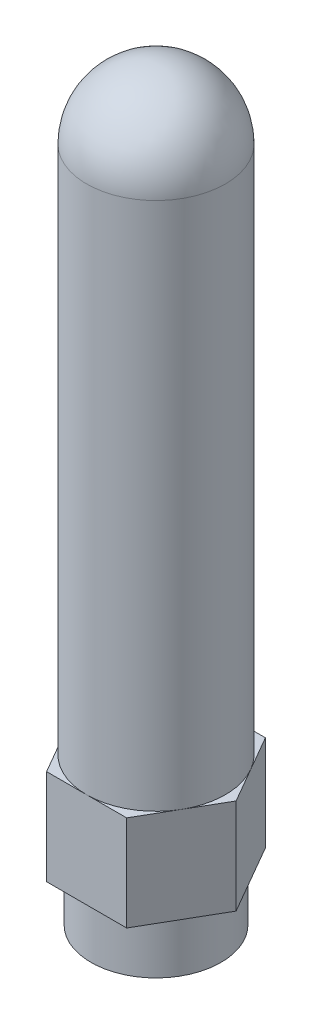
ISO-10303-21;
HEADER;
FILE_DESCRIPTION(('STEP AP214'),'2;1');
FILE_NAME('part.step','',(''),(''),'','','');
FILE_SCHEMA(('AUTOMOTIVE_DESIGN { 1 0 10303 214 1 1 1 1 }'));
ENDSEC;
DATA;
#1=APPLICATION_CONTEXT('core data for automotive mechanical design processes');
#2=APPLICATION_PROTOCOL_DEFINITION('international standard','automotive_design',2000,#1);
#3=PRODUCT_CONTEXT('',#1,'mechanical');
#4=PRODUCT('Part','Part','',(#3));
#5=PRODUCT_RELATED_PRODUCT_CATEGORY('part','',(#4));
#6=PRODUCT_DEFINITION_FORMATION('','',#4);
#7=PRODUCT_DEFINITION_CONTEXT('part definition',#1,'design');
#8=PRODUCT_DEFINITION('design','',#6,#7);
#9=PRODUCT_DEFINITION_SHAPE('','',#8);
#10=(LENGTH_UNIT() NAMED_UNIT(*) SI_UNIT(.MILLI.,.METRE.));
#11=(NAMED_UNIT(*) PLANE_ANGLE_UNIT() SI_UNIT($,.RADIAN.));
#12=(NAMED_UNIT(*) SI_UNIT($,.STERADIAN.) SOLID_ANGLE_UNIT());
#13=UNCERTAINTY_MEASURE_WITH_UNIT(LENGTH_MEASURE(1.E-05),#10,'distance_accuracy_value','');
#14=(GEOMETRIC_REPRESENTATION_CONTEXT(3) GLOBAL_UNCERTAINTY_ASSIGNED_CONTEXT((#13)) GLOBAL_UNIT_ASSIGNED_CONTEXT((#10,
#11,#12)) REPRESENTATION_CONTEXT('',''));
#15=CARTESIAN_POINT('',(0.,0.,0.));
#16=DIRECTION('',(0.,0.,1.));
#17=DIRECTION('',(1.,0.,0.));
#18=AXIS2_PLACEMENT_3D('',#15,#16,#17);
#19=CARTESIAN_POINT('',(0.,36.,0.));
#20=DIRECTION('',(0.,-1.,0.));
#21=DIRECTION('',(1.,0.,0.));
#22=AXIS2_PLACEMENT_3D('',#19,#20,#21);
#23=SPHERICAL_SURFACE('',#22,4.);
#24=CARTESIAN_POINT('',(0.,36.,0.));
#25=DIRECTION('',(0.,-1.,0.));
#26=DIRECTION('',(0.,0.,-1.));
#27=AXIS2_PLACEMENT_3D('',#24,#25,#26);
#28=CIRCLE('',#27,4.);
#29=CARTESIAN_POINT('',(0.,36.,-4.));
#30=VERTEX_POINT('',#29);
#31=EDGE_CURVE('E139',#30,#30,#28,.T.);
#32=ORIENTED_EDGE('',*,*,#31,.F.);
#33=EDGE_LOOP('',(#32));
#34=FACE_BOUND('',#33,.T.);
#35=ADVANCED_FACE('F38',(#34),#23,.T.);
#36=CARTESIAN_POINT('',(0.,0.,0.));
#37=DIRECTION('',(0.,-1.,0.));
#38=DIRECTION('',(0.,0.,-1.));
#39=AXIS2_PLACEMENT_3D('',#36,#37,#38);
#40=CYLINDRICAL_SURFACE('',#39,4.);
#41=CARTESIAN_POINT('',(0.,5.5,0.));
#42=DIRECTION('',(0.,1.,0.));
#43=DIRECTION('',(0.,0.,1.));
#44=AXIS2_PLACEMENT_3D('',#41,#42,#43);
#45=CIRCLE('',#44,4.);
#46=CARTESIAN_POINT('',(0.,5.5,4.));
#47=VERTEX_POINT('',#46);
#48=CARTESIAN_POINT('',(-3.46410161513776,5.5,2.));
#49=VERTEX_POINT('',#48);
#50=EDGE_CURVE('E47',#47,#49,#45,.F.);
#51=ORIENTED_EDGE('',*,*,#50,.F.);
#52=CARTESIAN_POINT('',(3.46410161513775,5.5,2.));
#53=VERTEX_POINT('',#52);
#54=EDGE_CURVE('E41',#53,#47,#45,.F.);
#55=ORIENTED_EDGE('',*,*,#54,.F.);
#56=CARTESIAN_POINT('',(3.46410161513775,5.5,-2.));
#57=VERTEX_POINT('',#56);
#58=EDGE_CURVE('E114',#57,#53,#45,.F.);
#59=ORIENTED_EDGE('',*,*,#58,.F.);
#60=CARTESIAN_POINT('',(0.,5.5,-4.));
#61=VERTEX_POINT('',#60);
#62=EDGE_CURVE('E249',#61,#57,#45,.F.);
#63=ORIENTED_EDGE('',*,*,#62,.F.);
#64=CARTESIAN_POINT('',(-3.46410161513775,5.5,-2.));
#65=VERTEX_POINT('',#64);
#66=EDGE_CURVE('E60',#65,#61,#45,.F.);
#67=ORIENTED_EDGE('',*,*,#66,.F.);
#68=EDGE_CURVE('E55',#49,#65,#45,.F.);
#69=ORIENTED_EDGE('',*,*,#68,.F.);
#70=EDGE_LOOP('',(#51,#55,#59,#63,#67,#69));
#71=FACE_BOUND('',#70,.T.);
#72=ORIENTED_EDGE('',*,*,#31,.T.);
#73=EDGE_LOOP('',(#72));
#74=FACE_BOUND('',#73,.T.);
#75=ADVANCED_FACE('F282',(#71,#74),#40,.T.);
#76=CARTESIAN_POINT('',(0.,5.5,0.));
#77=DIRECTION('',(0.,1.,0.));
#78=DIRECTION('',(0.,0.,1.));
#79=AXIS2_PLACEMENT_3D('',#76,#77,#78);
#80=PLANE('',#79);
#81=DIRECTION('',(1.,0.,0.));
#82=VECTOR('',#81,1.);
#83=CARTESIAN_POINT('',(-2.3094010767585,5.5,4.));
#84=LINE('',#83,#82);
#85=CARTESIAN_POINT('',(-2.3094010767585,5.5,4.));
#86=VERTEX_POINT('',#85);
#87=EDGE_CURVE('E163',#86,#47,#84,.T.);
#88=ORIENTED_EDGE('',*,*,#87,.T.);
#89=ORIENTED_EDGE('',*,*,#50,.T.);
#90=DIRECTION('',(0.5,0.,0.866025403784439));
#91=VECTOR('',#90,1.);
#92=CARTESIAN_POINT('',(-4.61880215351701,5.5,0.));
#93=LINE('',#92,#91);
#94=EDGE_CURVE('E189',#49,#86,#93,.T.);
#95=ORIENTED_EDGE('',*,*,#94,.T.);
#96=EDGE_LOOP('',(#88,#89,#95));
#97=FACE_BOUND('',#96,.T.);
#98=ADVANCED_FACE('F281',(#97),#80,.T.);
#99=CARTESIAN_POINT('',(-4.61880215351701,5.5,0.));
#100=VERTEX_POINT('',#99);
#101=EDGE_CURVE('E185',#100,#49,#93,.T.);
#102=ORIENTED_EDGE('',*,*,#101,.T.);
#103=ORIENTED_EDGE('',*,*,#68,.T.);
#104=DIRECTION('',(-0.5,0.,0.866025403784439));
#105=VECTOR('',#104,1.);
#106=CARTESIAN_POINT('',(-2.3094010767585,5.5,-4.));
#107=LINE('',#106,#105);
#108=EDGE_CURVE('E194',#65,#100,#107,.T.);
#109=ORIENTED_EDGE('',*,*,#108,.T.);
#110=EDGE_LOOP('',(#102,#103,#109));
#111=FACE_BOUND('',#110,.T.);
#112=ADVANCED_FACE('F303',(#111),#80,.T.);
#113=CARTESIAN_POINT('',(-2.3094010767585,5.5,-4.));
#114=VERTEX_POINT('',#113);
#115=EDGE_CURVE('E190',#114,#65,#107,.T.);
#116=ORIENTED_EDGE('',*,*,#115,.T.);
#117=ORIENTED_EDGE('',*,*,#66,.T.);
#118=DIRECTION('',(-1.,0.,0.));
#119=VECTOR('',#118,1.);
#120=CARTESIAN_POINT('',(2.3094010767585,5.5,-4.));
#121=LINE('',#120,#119);
#122=EDGE_CURVE('E131',#61,#114,#121,.T.);
#123=ORIENTED_EDGE('',*,*,#122,.T.);
#124=EDGE_LOOP('',(#116,#117,#123));
#125=FACE_BOUND('',#124,.T.);
#126=ADVANCED_FACE('F273',(#125),#80,.T.);
#127=CARTESIAN_POINT('',(2.3094010767585,5.5,-4.));
#128=VERTEX_POINT('',#127);
#129=EDGE_CURVE('E195',#128,#61,#121,.T.);
#130=ORIENTED_EDGE('',*,*,#129,.T.);
#131=ORIENTED_EDGE('',*,*,#62,.T.);
#132=DIRECTION('',(-0.5,0.,-0.866025403784439));
#133=VECTOR('',#132,1.);
#134=CARTESIAN_POINT('',(4.61880215351701,5.5,0.));
#135=LINE('',#134,#133);
#136=EDGE_CURVE('E129',#57,#128,#135,.T.);
#137=ORIENTED_EDGE('',*,*,#136,.T.);
#138=EDGE_LOOP('',(#130,#131,#137));
#139=FACE_BOUND('',#138,.T.);
#140=ADVANCED_FACE('F248',(#139),#80,.T.);
#141=CARTESIAN_POINT('',(4.61880215351701,5.5,0.));
#142=VERTEX_POINT('',#141);
#143=EDGE_CURVE('E113',#142,#57,#135,.T.);
#144=ORIENTED_EDGE('',*,*,#143,.T.);
#145=ORIENTED_EDGE('',*,*,#58,.T.);
#146=DIRECTION('',(0.5,0.,-0.866025403784439));
#147=VECTOR('',#146,1.);
#148=CARTESIAN_POINT('',(2.3094010767585,5.5,4.));
#149=LINE('',#148,#147);
#150=EDGE_CURVE('E110',#53,#142,#149,.T.);
#151=ORIENTED_EDGE('',*,*,#150,.T.);
#152=EDGE_LOOP('',(#144,#145,#151));
#153=FACE_BOUND('',#152,.T.);
#154=ADVANCED_FACE('F112',(#153),#80,.T.);
#155=CARTESIAN_POINT('',(2.3094010767585,5.5,4.));
#156=DIRECTION('',(-0.866025403784439,0.,-0.5));
#157=DIRECTION('',(-0.5,0.,0.866025403784439));
#158=AXIS2_PLACEMENT_3D('',#155,#156,#157);
#159=PLANE('',#158);
#160=DIRECTION('',(0.5,0.,-0.866025403784439));
#161=VECTOR('',#160,1.);
#162=CARTESIAN_POINT('',(2.3094010767585,0.,4.));
#163=LINE('',#162,#161);
#164=CARTESIAN_POINT('',(2.3094010767585,0.,4.));
#165=VERTEX_POINT('',#164);
#166=CARTESIAN_POINT('',(4.61880215351701,0.,0.));
#167=VERTEX_POINT('',#166);
#168=EDGE_CURVE('E136',#165,#167,#163,.T.);
#169=ORIENTED_EDGE('',*,*,#168,.T.);
#170=DIRECTION('',(0.,-1.,0.));
#171=VECTOR('',#170,1.);
#172=CARTESIAN_POINT('',(4.61880215351701,5.5,0.));
#173=LINE('',#172,#171);
#174=EDGE_CURVE('E127',#142,#167,#173,.T.);
#175=ORIENTED_EDGE('',*,*,#174,.F.);
#176=ORIENTED_EDGE('',*,*,#150,.F.);
#177=CARTESIAN_POINT('',(2.3094010767585,5.5,4.));
#178=VERTEX_POINT('',#177);
#179=EDGE_CURVE('E120',#178,#53,#149,.T.);
#180=ORIENTED_EDGE('',*,*,#179,.F.);
#181=DIRECTION('',(0.,-1.,0.));
#182=VECTOR('',#181,1.);
#183=CARTESIAN_POINT('',(2.3094010767585,5.5,4.));
#184=LINE('',#183,#182);
#185=EDGE_CURVE('E160',#178,#165,#184,.T.);
#186=ORIENTED_EDGE('',*,*,#185,.T.);
#187=EDGE_LOOP('',(#169,#175,#176,#180,#186));
#188=FACE_BOUND('',#187,.T.);
#189=ADVANCED_FACE('F133',(#188),#159,.F.);
#190=CARTESIAN_POINT('',(4.61880215351701,5.5,0.));
#191=DIRECTION('',(-0.866025403784439,0.,0.5));
#192=DIRECTION('',(0.5,0.,0.866025403784439));
#193=AXIS2_PLACEMENT_3D('',#190,#191,#192);
#194=PLANE('',#193);
#195=DIRECTION('',(-0.5,0.,-0.866025403784439));
#196=VECTOR('',#195,1.);
#197=CARTESIAN_POINT('',(4.61880215351701,0.,0.));
#198=LINE('',#197,#196);
#199=CARTESIAN_POINT('',(2.3094010767585,0.,-4.));
#200=VERTEX_POINT('',#199);
#201=EDGE_CURVE('E175',#167,#200,#198,.T.);
#202=ORIENTED_EDGE('',*,*,#201,.T.);
#203=DIRECTION('',(0.,-1.,0.));
#204=VECTOR('',#203,1.);
#205=CARTESIAN_POINT('',(2.3094010767585,5.5,-4.));
#206=LINE('',#205,#204);
#207=EDGE_CURVE('E140',#128,#200,#206,.T.);
#208=ORIENTED_EDGE('',*,*,#207,.F.);
#209=ORIENTED_EDGE('',*,*,#136,.F.);
#210=ORIENTED_EDGE('',*,*,#143,.F.);
#211=ORIENTED_EDGE('',*,*,#174,.T.);
#212=EDGE_LOOP('',(#202,#208,#209,#210,#211));
#213=FACE_BOUND('',#212,.T.);
#214=ADVANCED_FACE('F126',(#213),#194,.F.);
#215=CARTESIAN_POINT('',(2.3094010767585,5.5,-4.));
#216=DIRECTION('',(0.,0.,1.));
#217=DIRECTION('',(1.,0.,0.));
#218=AXIS2_PLACEMENT_3D('',#215,#216,#217);
#219=PLANE('',#218);
#220=DIRECTION('',(-1.,0.,0.));
#221=VECTOR('',#220,1.);
#222=CARTESIAN_POINT('',(2.3094010767585,0.,-4.));
#223=LINE('',#222,#221);
#224=CARTESIAN_POINT('',(-2.3094010767585,0.,-4.));
#225=VERTEX_POINT('',#224);
#226=EDGE_CURVE('E172',#200,#225,#223,.T.);
#227=ORIENTED_EDGE('',*,*,#226,.T.);
#228=DIRECTION('',(0.,-1.,0.));
#229=VECTOR('',#228,1.);
#230=CARTESIAN_POINT('',(-2.3094010767585,5.5,-4.));
#231=LINE('',#230,#229);
#232=EDGE_CURVE('E146',#114,#225,#231,.T.);
#233=ORIENTED_EDGE('',*,*,#232,.F.);
#234=ORIENTED_EDGE('',*,*,#122,.F.);
#235=ORIENTED_EDGE('',*,*,#129,.F.);
#236=ORIENTED_EDGE('',*,*,#207,.T.);
#237=EDGE_LOOP('',(#227,#233,#234,#235,#236));
#238=FACE_BOUND('',#237,.T.);
#239=ADVANCED_FACE('F243',(#238),#219,.F.);
#240=CARTESIAN_POINT('',(-2.3094010767585,5.5,-4.));
#241=DIRECTION('',(0.866025403784439,0.,0.5));
#242=DIRECTION('',(0.5,0.,-0.866025403784439));
#243=AXIS2_PLACEMENT_3D('',#240,#241,#242);
#244=PLANE('',#243);
#245=DIRECTION('',(-0.5,0.,0.866025403784439));
#246=VECTOR('',#245,1.);
#247=CARTESIAN_POINT('',(-2.3094010767585,0.,-4.));
#248=LINE('',#247,#246);
#249=CARTESIAN_POINT('',(-4.61880215351701,0.,0.));
#250=VERTEX_POINT('',#249);
#251=EDGE_CURVE('E169',#225,#250,#248,.T.);
#252=ORIENTED_EDGE('',*,*,#251,.T.);
#253=DIRECTION('',(0.,-1.,0.));
#254=VECTOR('',#253,1.);
#255=CARTESIAN_POINT('',(-4.61880215351701,5.5,0.));
#256=LINE('',#255,#254);
#257=EDGE_CURVE('E152',#100,#250,#256,.T.);
#258=ORIENTED_EDGE('',*,*,#257,.F.);
#259=ORIENTED_EDGE('',*,*,#108,.F.);
#260=ORIENTED_EDGE('',*,*,#115,.F.);
#261=ORIENTED_EDGE('',*,*,#232,.T.);
#262=EDGE_LOOP('',(#252,#258,#259,#260,#261));
#263=FACE_BOUND('',#262,.T.);
#264=ADVANCED_FACE('F269',(#263),#244,.F.);
#265=CARTESIAN_POINT('',(-4.61880215351701,5.5,0.));
#266=DIRECTION('',(0.866025403784439,0.,-0.5));
#267=DIRECTION('',(-0.5,0.,-0.866025403784439));
#268=AXIS2_PLACEMENT_3D('',#265,#266,#267);
#269=PLANE('',#268);
#270=DIRECTION('',(0.5,0.,0.866025403784439));
#271=VECTOR('',#270,1.);
#272=CARTESIAN_POINT('',(-4.61880215351701,0.,0.));
#273=LINE('',#272,#271);
#274=CARTESIAN_POINT('',(-2.3094010767585,0.,4.));
#275=VERTEX_POINT('',#274);
#276=EDGE_CURVE('E166',#250,#275,#273,.T.);
#277=ORIENTED_EDGE('',*,*,#276,.T.);
#278=DIRECTION('',(0.,-1.,0.));
#279=VECTOR('',#278,1.);
#280=CARTESIAN_POINT('',(-2.3094010767585,5.5,4.));
#281=LINE('',#280,#279);
#282=EDGE_CURVE('E156',#86,#275,#281,.T.);
#283=ORIENTED_EDGE('',*,*,#282,.F.);
#284=ORIENTED_EDGE('',*,*,#94,.F.);
#285=ORIENTED_EDGE('',*,*,#101,.F.);
#286=ORIENTED_EDGE('',*,*,#257,.T.);
#287=EDGE_LOOP('',(#277,#283,#284,#285,#286));
#288=FACE_BOUND('',#287,.T.);
#289=ADVANCED_FACE('F265',(#288),#269,.F.);
#290=CARTESIAN_POINT('',(-2.3094010767585,5.5,4.));
#291=DIRECTION('',(0.,0.,-1.));
#292=DIRECTION('',(-1.,0.,0.));
#293=AXIS2_PLACEMENT_3D('',#290,#291,#292);
#294=PLANE('',#293);
#295=DIRECTION('',(1.,0.,0.));
#296=VECTOR('',#295,1.);
#297=CARTESIAN_POINT('',(-2.3094010767585,0.,4.));
#298=LINE('',#297,#296);
#299=EDGE_CURVE('E121',#275,#165,#298,.T.);
#300=ORIENTED_EDGE('',*,*,#299,.T.);
#301=ORIENTED_EDGE('',*,*,#185,.F.);
#302=EDGE_CURVE('E184',#47,#178,#84,.T.);
#303=ORIENTED_EDGE('',*,*,#302,.F.);
#304=ORIENTED_EDGE('',*,*,#87,.F.);
#305=ORIENTED_EDGE('',*,*,#282,.T.);
#306=EDGE_LOOP('',(#300,#301,#303,#304,#305));
#307=FACE_BOUND('',#306,.T.);
#308=ADVANCED_FACE('F261',(#307),#294,.F.);
#309=ORIENTED_EDGE('',*,*,#179,.T.);
#310=ORIENTED_EDGE('',*,*,#54,.T.);
#311=ORIENTED_EDGE('',*,*,#302,.T.);
#312=EDGE_LOOP('',(#309,#310,#311));
#313=FACE_BOUND('',#312,.T.);
#314=ADVANCED_FACE('F235',(#313),#80,.T.);
#315=CARTESIAN_POINT('',(0.,0.,0.));
#316=DIRECTION('',(0.,-1.,0.));
#317=DIRECTION('',(0.,0.,-1.));
#318=AXIS2_PLACEMENT_3D('',#315,#316,#317);
#319=PLANE('',#318);
#320=CARTESIAN_POINT('',(0.,0.,0.));
#321=DIRECTION('',(0.,-1.,0.));
#322=DIRECTION('',(0.,0.,-1.));
#323=AXIS2_PLACEMENT_3D('',#320,#321,#322);
#324=CIRCLE('',#323,3.75);
#325=CARTESIAN_POINT('',(0.,0.,-3.75));
#326=VERTEX_POINT('',#325);
#327=EDGE_CURVE('E11',#326,#326,#324,.T.);
#328=ORIENTED_EDGE('',*,*,#327,.F.);
#329=EDGE_LOOP('',(#328));
#330=FACE_BOUND('',#329,.T.);
#331=ORIENTED_EDGE('',*,*,#168,.F.);
#332=ORIENTED_EDGE('',*,*,#299,.F.);
#333=ORIENTED_EDGE('',*,*,#276,.F.);
#334=ORIENTED_EDGE('',*,*,#251,.F.);
#335=ORIENTED_EDGE('',*,*,#226,.F.);
#336=ORIENTED_EDGE('',*,*,#201,.F.);
#337=EDGE_LOOP('',(#331,#332,#333,#334,#335,#336));
#338=FACE_BOUND('',#337,.T.);
#339=ADVANCED_FACE('F229',(#330,#338),#319,.T.);
#340=CARTESIAN_POINT('',(0.,-3.,0.));
#341=DIRECTION('',(0.,1.,0.));
#342=DIRECTION('',(0.,0.,1.));
#343=AXIS2_PLACEMENT_3D('',#340,#341,#342);
#344=CYLINDRICAL_SURFACE('',#343,3.75);
#345=CARTESIAN_POINT('',(0.,-3.,0.));
#346=DIRECTION('',(0.,-1.,0.));
#347=DIRECTION('',(0.,0.,-1.));
#348=AXIS2_PLACEMENT_3D('',#345,#346,#347);
#349=CIRCLE('',#348,3.75);
#350=CARTESIAN_POINT('',(0.,-3.,-3.75));
#351=VERTEX_POINT('',#350);
#352=EDGE_CURVE('E180',#351,#351,#349,.T.);
#353=ORIENTED_EDGE('',*,*,#352,.F.);
#354=EDGE_LOOP('',(#353));
#355=FACE_BOUND('',#354,.T.);
#356=ORIENTED_EDGE('',*,*,#327,.T.);
#357=EDGE_LOOP('',(#356));
#358=FACE_BOUND('',#357,.T.);
#359=ADVANCED_FACE('F223',(#355,#358),#344,.T.);
#360=CARTESIAN_POINT('',(0.,-3.,0.));
#361=DIRECTION('',(0.,-1.,0.));
#362=DIRECTION('',(0.,0.,-1.));
#363=AXIS2_PLACEMENT_3D('',#360,#361,#362);
#364=PLANE('',#363);
#365=CARTESIAN_POINT('',(0.,-3.,0.));
#366=DIRECTION('',(0.,-1.,0.));
#367=DIRECTION('',(0.,0.,-1.));
#368=AXIS2_PLACEMENT_3D('',#365,#366,#367);
#369=CIRCLE('',#368,3.);
#370=CARTESIAN_POINT('',(0.,-3.,-3.));
#371=VERTEX_POINT('',#370);
#372=EDGE_CURVE('E204',#371,#371,#369,.T.);
#373=ORIENTED_EDGE('',*,*,#372,.F.);
#374=EDGE_LOOP('',(#373));
#375=FACE_BOUND('',#374,.T.);
#376=ORIENTED_EDGE('',*,*,#352,.T.);
#377=EDGE_LOOP('',(#376));
#378=FACE_BOUND('',#377,.T.);
#379=ADVANCED_FACE('F217',(#375,#378),#364,.T.);
#380=CARTESIAN_POINT('',(0.,5.,0.));
#381=DIRECTION('',(0.,-1.,0.));
#382=DIRECTION('',(0.,0.,-1.));
#383=AXIS2_PLACEMENT_3D('',#380,#381,#382);
#384=CYLINDRICAL_SURFACE('',#383,3.);
#385=CARTESIAN_POINT('',(0.,5.,0.));
#386=DIRECTION('',(0.,-1.,0.));
#387=DIRECTION('',(0.,0.,-1.));
#388=AXIS2_PLACEMENT_3D('',#385,#386,#387);
#389=CIRCLE('',#388,3.);
#390=CARTESIAN_POINT('',(0.,5.,-3.));
#391=VERTEX_POINT('',#390);
#392=EDGE_CURVE('E203',#391,#391,#389,.T.);
#393=ORIENTED_EDGE('',*,*,#392,.F.);
#394=EDGE_LOOP('',(#393));
#395=FACE_BOUND('',#394,.T.);
#396=ORIENTED_EDGE('',*,*,#372,.T.);
#397=EDGE_LOOP('',(#396));
#398=FACE_BOUND('',#397,.T.);
#399=ADVANCED_FACE('F214',(#395,#398),#384,.F.);
#400=CARTESIAN_POINT('',(0.,5.,0.));
#401=DIRECTION('',(0.,-1.,0.));
#402=DIRECTION('',(0.,0.,-1.));
#403=AXIS2_PLACEMENT_3D('',#400,#401,#402);
#404=PLANE('',#403);
#405=ORIENTED_EDGE('',*,*,#392,.T.);
#406=EDGE_LOOP('',(#405));
#407=FACE_BOUND('',#406,.T.);
#408=ADVANCED_FACE('F212',(#407),#404,.T.);
#409=CLOSED_SHELL('',(#35,#75,#98,#112,#126,#140,#154,#189,#214,#239,#264,#289,#308,#314,#339,
#359,#379,#399,#408));
#410=MANIFOLD_SOLID_BREP('B2',#409);
#411=ADVANCED_BREP_SHAPE_REPRESENTATION('',(#18,#410),#14);
#412=SHAPE_DEFINITION_REPRESENTATION(#9,#411);
ENDSEC;
END-ISO-10303-21;
